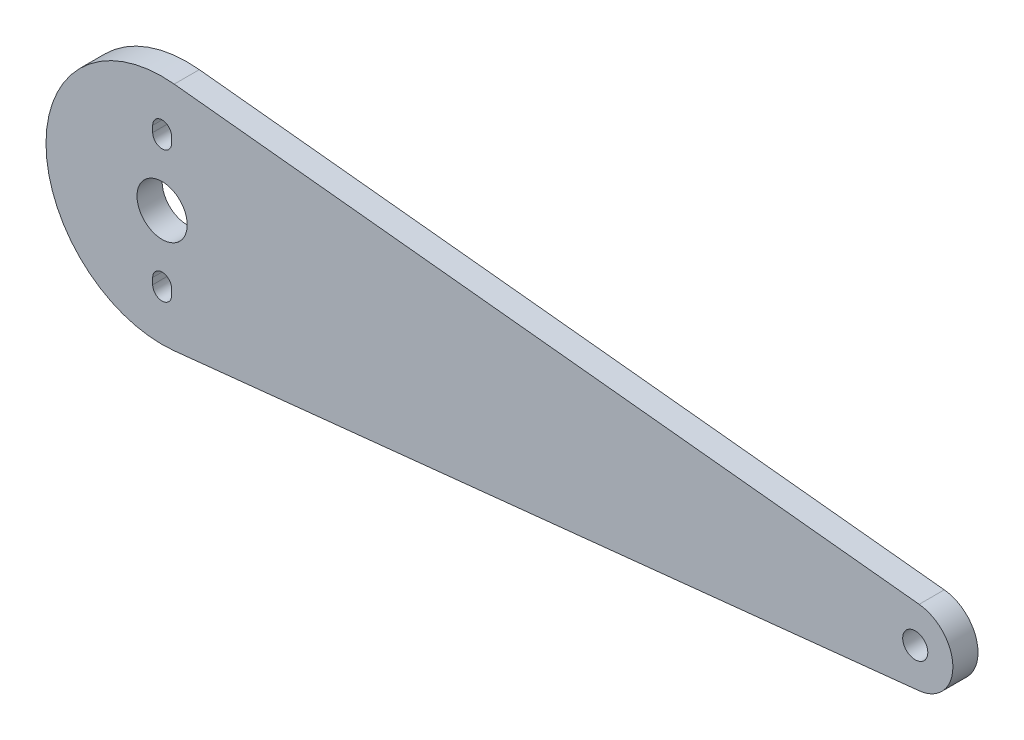
ISO-10303-21;
HEADER;
FILE_DESCRIPTION(('STEP AP214'),'2;1');
FILE_NAME('part.step','',(''),(''),'','','');
FILE_SCHEMA(('AUTOMOTIVE_DESIGN { 1 0 10303 214 1 1 1 1 }'));
ENDSEC;
DATA;
#1=APPLICATION_CONTEXT('core data for automotive mechanical design processes');
#2=APPLICATION_PROTOCOL_DEFINITION('international standard','automotive_design',2000,#1);
#3=PRODUCT_CONTEXT('',#1,'mechanical');
#4=PRODUCT('Part','Part','',(#3));
#5=PRODUCT_RELATED_PRODUCT_CATEGORY('part','',(#4));
#6=PRODUCT_DEFINITION_FORMATION('','',#4);
#7=PRODUCT_DEFINITION_CONTEXT('part definition',#1,'design');
#8=PRODUCT_DEFINITION('design','',#6,#7);
#9=PRODUCT_DEFINITION_SHAPE('','',#8);
#10=(LENGTH_UNIT() NAMED_UNIT(*) SI_UNIT(.MILLI.,.METRE.));
#11=(NAMED_UNIT(*) PLANE_ANGLE_UNIT() SI_UNIT($,.RADIAN.));
#12=(NAMED_UNIT(*) SI_UNIT($,.STERADIAN.) SOLID_ANGLE_UNIT());
#13=UNCERTAINTY_MEASURE_WITH_UNIT(LENGTH_MEASURE(1.E-05),#10,'distance_accuracy_value','');
#14=(GEOMETRIC_REPRESENTATION_CONTEXT(3) GLOBAL_UNCERTAINTY_ASSIGNED_CONTEXT((#13)) GLOBAL_UNIT_ASSIGNED_CONTEXT((#10,
#11,#12)) REPRESENTATION_CONTEXT('',''));
#15=CARTESIAN_POINT('',(0.,0.,0.));
#16=DIRECTION('',(0.,0.,1.));
#17=DIRECTION('',(1.,0.,0.));
#18=AXIS2_PLACEMENT_3D('',#15,#16,#17);
#19=CARTESIAN_POINT('',(-60.,0.,4.));
#20=DIRECTION('',(0.,0.,1.));
#21=DIRECTION('',(1.,0.,0.));
#22=AXIS2_PLACEMENT_3D('',#19,#20,#21);
#23=PLANE('',#22);
#24=DIRECTION('',(0.,-1.,0.));
#25=VECTOR('',#24,1.);
#26=CARTESIAN_POINT('',(-61.5,11.,4.));
#27=LINE('',#26,#25);
#28=CARTESIAN_POINT('',(-61.5,11.,4.));
#29=VERTEX_POINT('',#28);
#30=CARTESIAN_POINT('',(-61.5,10.,4.));
#31=VERTEX_POINT('',#30);
#32=EDGE_CURVE('E159',#29,#31,#27,.T.);
#33=ORIENTED_EDGE('',*,*,#32,.F.);
#34=CARTESIAN_POINT('',(-60.,11.,4.));
#35=DIRECTION('',(0.,0.,1.));
#36=DIRECTION('',(1.,0.,0.));
#37=AXIS2_PLACEMENT_3D('',#34,#35,#36);
#38=CIRCLE('',#37,1.50000000000002);
#39=CARTESIAN_POINT('',(-58.5,11.,4.));
#40=VERTEX_POINT('',#39);
#41=EDGE_CURVE('E157',#40,#29,#38,.T.);
#42=ORIENTED_EDGE('',*,*,#41,.F.);
#43=DIRECTION('',(0.,1.,0.));
#44=VECTOR('',#43,1.);
#45=CARTESIAN_POINT('',(-58.5,11.,4.));
#46=LINE('',#45,#44);
#47=CARTESIAN_POINT('',(-58.5,10.,4.));
#48=VERTEX_POINT('',#47);
#49=EDGE_CURVE('E165',#48,#40,#46,.T.);
#50=ORIENTED_EDGE('',*,*,#49,.F.);
#51=CARTESIAN_POINT('',(-60.,10.,4.));
#52=DIRECTION('',(0.,0.,1.));
#53=DIRECTION('',(1.,0.,0.));
#54=AXIS2_PLACEMENT_3D('',#51,#52,#53);
#55=CIRCLE('',#54,1.50000000000002);
#56=EDGE_CURVE('E162',#31,#48,#55,.T.);
#57=ORIENTED_EDGE('',*,*,#56,.F.);
#58=EDGE_LOOP('',(#33,#42,#50,#57));
#59=FACE_BOUND('',#58,.T.);
#60=CARTESIAN_POINT('',(60.,0.,4.));
#61=DIRECTION('',(0.,0.,1.));
#62=DIRECTION('',(1.,0.,0.));
#63=AXIS2_PLACEMENT_3D('',#60,#61,#62);
#64=CIRCLE('',#63,2.);
#65=CARTESIAN_POINT('',(62.,0.,4.));
#66=VERTEX_POINT('',#65);
#67=EDGE_CURVE('E194',#66,#66,#64,.T.);
#68=ORIENTED_EDGE('',*,*,#67,.F.);
#69=EDGE_LOOP('',(#68));
#70=FACE_BOUND('',#69,.T.);
#71=CARTESIAN_POINT('',(-60.,0.,4.));
#72=DIRECTION('',(0.,0.,1.));
#73=DIRECTION('',(1.,0.,0.));
#74=AXIS2_PLACEMENT_3D('',#71,#72,#73);
#75=CIRCLE('',#74,18.5);
#76=CARTESIAN_POINT('',(-58.0729166666667,18.399357321015,4.));
#77=VERTEX_POINT('',#76);
#78=CARTESIAN_POINT('',(-58.0729166666667,-18.399357321015,4.));
#79=VERTEX_POINT('',#78);
#80=EDGE_CURVE('E200',#77,#79,#75,.T.);
#81=ORIENTED_EDGE('',*,*,#80,.T.);
#82=DIRECTION('',(0.994559855190001,0.104166666666667,0.));
#83=VECTOR('',#82,1.);
#84=CARTESIAN_POINT('',(-58.0729166666667,-18.399357321015,4.));
#85=LINE('',#84,#83);
#86=CARTESIAN_POINT('',(60.625,-5.96735913114,4.));
#87=VERTEX_POINT('',#86);
#88=EDGE_CURVE('E203',#79,#87,#85,.T.);
#89=ORIENTED_EDGE('',*,*,#88,.T.);
#90=CARTESIAN_POINT('',(60.,0.,4.));
#91=DIRECTION('',(0.,0.,1.));
#92=DIRECTION('',(1.,0.,0.));
#93=AXIS2_PLACEMENT_3D('',#90,#91,#92);
#94=CIRCLE('',#93,6.);
#95=CARTESIAN_POINT('',(60.625,5.96735913114001,4.));
#96=VERTEX_POINT('',#95);
#97=EDGE_CURVE('E206',#87,#96,#94,.T.);
#98=ORIENTED_EDGE('',*,*,#97,.T.);
#99=DIRECTION('',(-0.994559855190001,0.104166666666667,0.));
#100=VECTOR('',#99,1.);
#101=CARTESIAN_POINT('',(-58.0729166666667,18.399357321015,4.));
#102=LINE('',#101,#100);
#103=EDGE_CURVE('E208',#96,#77,#102,.T.);
#104=ORIENTED_EDGE('',*,*,#103,.T.);
#105=EDGE_LOOP('',(#81,#89,#98,#104));
#106=FACE_BOUND('',#105,.T.);
#107=CARTESIAN_POINT('',(-60.,0.,4.));
#108=DIRECTION('',(0.,0.,1.));
#109=DIRECTION('',(1.,0.,0.));
#110=AXIS2_PLACEMENT_3D('',#107,#108,#109);
#111=CIRCLE('',#110,4.00000000000001);
#112=CARTESIAN_POINT('',(-56.,0.,4.));
#113=VERTEX_POINT('',#112);
#114=EDGE_CURVE('E188',#113,#113,#111,.T.);
#115=ORIENTED_EDGE('',*,*,#114,.F.);
#116=EDGE_LOOP('',(#115));
#117=FACE_BOUND('',#116,.T.);
#118=DIRECTION('',(0.,1.,0.));
#119=VECTOR('',#118,1.);
#120=CARTESIAN_POINT('',(-58.5,-11.,4.));
#121=LINE('',#120,#119);
#122=CARTESIAN_POINT('',(-58.5,-11.,4.));
#123=VERTEX_POINT('',#122);
#124=CARTESIAN_POINT('',(-58.5,-10.,4.));
#125=VERTEX_POINT('',#124);
#126=EDGE_CURVE('E129',#123,#125,#121,.T.);
#127=ORIENTED_EDGE('',*,*,#126,.F.);
#128=CARTESIAN_POINT('',(-60.,-11.,4.));
#129=DIRECTION('',(0.,0.,1.));
#130=DIRECTION('',(-1.,0.,0.));
#131=AXIS2_PLACEMENT_3D('',#128,#129,#130);
#132=CIRCLE('',#131,1.50000000000002);
#133=CARTESIAN_POINT('',(-61.5,-11.,4.));
#134=VERTEX_POINT('',#133);
#135=EDGE_CURVE('E121',#134,#123,#132,.T.);
#136=ORIENTED_EDGE('',*,*,#135,.F.);
#137=DIRECTION('',(0.,-1.,0.));
#138=VECTOR('',#137,1.);
#139=CARTESIAN_POINT('',(-61.5,-11.,4.));
#140=LINE('',#139,#138);
#141=CARTESIAN_POINT('',(-61.5,-10.,4.));
#142=VERTEX_POINT('',#141);
#143=EDGE_CURVE('E143',#142,#134,#140,.T.);
#144=ORIENTED_EDGE('',*,*,#143,.F.);
#145=CARTESIAN_POINT('',(-60.,-10.,4.));
#146=DIRECTION('',(0.,0.,1.));
#147=DIRECTION('',(-1.,0.,0.));
#148=AXIS2_PLACEMENT_3D('',#145,#146,#147);
#149=CIRCLE('',#148,1.50000000000002);
#150=EDGE_CURVE('E141',#125,#142,#149,.T.);
#151=ORIENTED_EDGE('',*,*,#150,.F.);
#152=EDGE_LOOP('',(#127,#136,#144,#151));
#153=FACE_BOUND('',#152,.T.);
#154=ADVANCED_FACE('F32',(#59,#70,#106,#117,#153),#23,.T.);
#155=CARTESIAN_POINT('',(-60.,0.,0.));
#156=DIRECTION('',(0.,0.,1.));
#157=DIRECTION('',(1.,0.,0.));
#158=AXIS2_PLACEMENT_3D('',#155,#156,#157);
#159=PLANE('',#158);
#160=CARTESIAN_POINT('',(-60.,11.,0.));
#161=DIRECTION('',(0.,0.,1.));
#162=DIRECTION('',(1.,0.,0.));
#163=AXIS2_PLACEMENT_3D('',#160,#161,#162);
#164=CIRCLE('',#163,1.50000000000002);
#165=CARTESIAN_POINT('',(-58.5,11.,0.));
#166=VERTEX_POINT('',#165);
#167=CARTESIAN_POINT('',(-61.5,11.,0.));
#168=VERTEX_POINT('',#167);
#169=EDGE_CURVE('E137',#166,#168,#164,.T.);
#170=ORIENTED_EDGE('',*,*,#169,.T.);
#171=DIRECTION('',(0.,-1.,0.));
#172=VECTOR('',#171,1.);
#173=CARTESIAN_POINT('',(-61.5,11.,0.));
#174=LINE('',#173,#172);
#175=CARTESIAN_POINT('',(-61.5,10.,0.));
#176=VERTEX_POINT('',#175);
#177=EDGE_CURVE('E170',#168,#176,#174,.T.);
#178=ORIENTED_EDGE('',*,*,#177,.T.);
#179=CARTESIAN_POINT('',(-60.,10.,0.));
#180=DIRECTION('',(0.,0.,1.));
#181=DIRECTION('',(1.,0.,0.));
#182=AXIS2_PLACEMENT_3D('',#179,#180,#181);
#183=CIRCLE('',#182,1.50000000000002);
#184=CARTESIAN_POINT('',(-58.5,10.,0.));
#185=VERTEX_POINT('',#184);
#186=EDGE_CURVE('E173',#176,#185,#183,.T.);
#187=ORIENTED_EDGE('',*,*,#186,.T.);
#188=DIRECTION('',(0.,1.,0.));
#189=VECTOR('',#188,1.);
#190=CARTESIAN_POINT('',(-58.5,11.,0.));
#191=LINE('',#190,#189);
#192=EDGE_CURVE('E160',#185,#166,#191,.T.);
#193=ORIENTED_EDGE('',*,*,#192,.T.);
#194=EDGE_LOOP('',(#170,#178,#187,#193));
#195=FACE_BOUND('',#194,.T.);
#196=CARTESIAN_POINT('',(60.,0.,0.));
#197=DIRECTION('',(0.,0.,1.));
#198=DIRECTION('',(1.,0.,0.));
#199=AXIS2_PLACEMENT_3D('',#196,#197,#198);
#200=CIRCLE('',#199,2.);
#201=CARTESIAN_POINT('',(62.,0.,0.));
#202=VERTEX_POINT('',#201);
#203=EDGE_CURVE('E191',#202,#202,#200,.T.);
#204=ORIENTED_EDGE('',*,*,#203,.T.);
#205=EDGE_LOOP('',(#204));
#206=FACE_BOUND('',#205,.T.);
#207=CARTESIAN_POINT('',(-60.,0.,0.));
#208=DIRECTION('',(0.,0.,1.));
#209=DIRECTION('',(1.,0.,0.));
#210=AXIS2_PLACEMENT_3D('',#207,#208,#209);
#211=CIRCLE('',#210,18.5);
#212=CARTESIAN_POINT('',(-58.0729166666667,18.399357321015,0.));
#213=VERTEX_POINT('',#212);
#214=CARTESIAN_POINT('',(-58.0729166666667,-18.399357321015,0.));
#215=VERTEX_POINT('',#214);
#216=EDGE_CURVE('E197',#213,#215,#211,.T.);
#217=ORIENTED_EDGE('',*,*,#216,.F.);
#218=DIRECTION('',(-0.994559855190001,0.104166666666667,0.));
#219=VECTOR('',#218,1.);
#220=CARTESIAN_POINT('',(-58.0729166666667,18.399357321015,0.));
#221=LINE('',#220,#219);
#222=CARTESIAN_POINT('',(60.625,5.96735913114001,0.));
#223=VERTEX_POINT('',#222);
#224=EDGE_CURVE('E204',#223,#213,#221,.T.);
#225=ORIENTED_EDGE('',*,*,#224,.F.);
#226=CARTESIAN_POINT('',(60.,0.,0.));
#227=DIRECTION('',(0.,0.,1.));
#228=DIRECTION('',(1.,0.,0.));
#229=AXIS2_PLACEMENT_3D('',#226,#227,#228);
#230=CIRCLE('',#229,6.);
#231=CARTESIAN_POINT('',(60.625,-5.96735913114,0.));
#232=VERTEX_POINT('',#231);
#233=EDGE_CURVE('E215',#232,#223,#230,.T.);
#234=ORIENTED_EDGE('',*,*,#233,.F.);
#235=DIRECTION('',(0.994559855190001,0.104166666666667,0.));
#236=VECTOR('',#235,1.);
#237=CARTESIAN_POINT('',(-58.0729166666667,-18.399357321015,0.));
#238=LINE('',#237,#236);
#239=EDGE_CURVE('E213',#215,#232,#238,.T.);
#240=ORIENTED_EDGE('',*,*,#239,.F.);
#241=EDGE_LOOP('',(#217,#225,#234,#240));
#242=FACE_BOUND('',#241,.T.);
#243=CARTESIAN_POINT('',(-60.,0.,0.));
#244=DIRECTION('',(0.,0.,1.));
#245=DIRECTION('',(1.,0.,0.));
#246=AXIS2_PLACEMENT_3D('',#243,#244,#245);
#247=CIRCLE('',#246,4.00000000000001);
#248=CARTESIAN_POINT('',(-56.,0.,0.));
#249=VERTEX_POINT('',#248);
#250=EDGE_CURVE('E187',#249,#249,#247,.T.);
#251=ORIENTED_EDGE('',*,*,#250,.T.);
#252=EDGE_LOOP('',(#251));
#253=FACE_BOUND('',#252,.T.);
#254=CARTESIAN_POINT('',(-60.,-11.,0.));
#255=DIRECTION('',(0.,0.,1.));
#256=DIRECTION('',(-1.,0.,0.));
#257=AXIS2_PLACEMENT_3D('',#254,#255,#256);
#258=CIRCLE('',#257,1.50000000000002);
#259=CARTESIAN_POINT('',(-61.5,-11.,0.));
#260=VERTEX_POINT('',#259);
#261=CARTESIAN_POINT('',(-58.5,-11.,0.));
#262=VERTEX_POINT('',#261);
#263=EDGE_CURVE('E55',#260,#262,#258,.T.);
#264=ORIENTED_EDGE('',*,*,#263,.T.);
#265=DIRECTION('',(0.,1.,0.));
#266=VECTOR('',#265,1.);
#267=CARTESIAN_POINT('',(-58.5,-11.,0.));
#268=LINE('',#267,#266);
#269=CARTESIAN_POINT('',(-58.5,-10.,0.));
#270=VERTEX_POINT('',#269);
#271=EDGE_CURVE('E136',#262,#270,#268,.T.);
#272=ORIENTED_EDGE('',*,*,#271,.T.);
#273=CARTESIAN_POINT('',(-60.,-10.,0.));
#274=DIRECTION('',(0.,0.,1.));
#275=DIRECTION('',(-1.,0.,0.));
#276=AXIS2_PLACEMENT_3D('',#273,#274,#275);
#277=CIRCLE('',#276,1.50000000000002);
#278=CARTESIAN_POINT('',(-61.5,-10.,0.));
#279=VERTEX_POINT('',#278);
#280=EDGE_CURVE('E149',#270,#279,#277,.T.);
#281=ORIENTED_EDGE('',*,*,#280,.T.);
#282=DIRECTION('',(0.,-1.,0.));
#283=VECTOR('',#282,1.);
#284=CARTESIAN_POINT('',(-61.5,-11.,0.));
#285=LINE('',#284,#283);
#286=EDGE_CURVE('E130',#279,#260,#285,.T.);
#287=ORIENTED_EDGE('',*,*,#286,.T.);
#288=EDGE_LOOP('',(#264,#272,#281,#287));
#289=FACE_BOUND('',#288,.T.);
#290=ADVANCED_FACE('F233',(#195,#206,#242,#253,#289),#159,.F.);
#291=CARTESIAN_POINT('',(-60.,0.,4.));
#292=DIRECTION('',(0.,0.,-1.));
#293=DIRECTION('',(-1.,0.,0.));
#294=AXIS2_PLACEMENT_3D('',#291,#292,#293);
#295=CYLINDRICAL_SURFACE('',#294,18.5);
#296=ORIENTED_EDGE('',*,*,#216,.T.);
#297=DIRECTION('',(0.,0.,-1.));
#298=VECTOR('',#297,1.);
#299=CARTESIAN_POINT('',(-58.0729166666667,-18.399357321015,4.));
#300=LINE('',#299,#298);
#301=EDGE_CURVE('E11',#79,#215,#300,.T.);
#302=ORIENTED_EDGE('',*,*,#301,.F.);
#303=ORIENTED_EDGE('',*,*,#80,.F.);
#304=DIRECTION('',(0.,0.,-1.));
#305=VECTOR('',#304,1.);
#306=CARTESIAN_POINT('',(-58.0729166666667,18.399357321015,4.));
#307=LINE('',#306,#305);
#308=EDGE_CURVE('E210',#77,#213,#307,.T.);
#309=ORIENTED_EDGE('',*,*,#308,.T.);
#310=EDGE_LOOP('',(#296,#302,#303,#309));
#311=FACE_BOUND('',#310,.T.);
#312=ADVANCED_FACE('F34',(#311),#295,.T.);
#313=CARTESIAN_POINT('',(-58.0729166666667,-18.399357321015,4.));
#314=DIRECTION('',(-0.104166666666667,0.994559855190001,0.));
#315=DIRECTION('',(-0.994559855190001,-0.104166666666667,0.));
#316=AXIS2_PLACEMENT_3D('',#313,#314,#315);
#317=PLANE('',#316);
#318=ORIENTED_EDGE('',*,*,#239,.T.);
#319=DIRECTION('',(0.,0.,-1.));
#320=VECTOR('',#319,1.);
#321=CARTESIAN_POINT('',(60.625,-5.96735913114,4.));
#322=LINE('',#321,#320);
#323=EDGE_CURVE('E40',#87,#232,#322,.T.);
#324=ORIENTED_EDGE('',*,*,#323,.F.);
#325=ORIENTED_EDGE('',*,*,#88,.F.);
#326=ORIENTED_EDGE('',*,*,#301,.T.);
#327=EDGE_LOOP('',(#318,#324,#325,#326));
#328=FACE_BOUND('',#327,.T.);
#329=ADVANCED_FACE('F244',(#328),#317,.F.);
#330=CARTESIAN_POINT('',(60.,0.,4.));
#331=DIRECTION('',(0.,0.,-1.));
#332=DIRECTION('',(-1.,0.,0.));
#333=AXIS2_PLACEMENT_3D('',#330,#331,#332);
#334=CYLINDRICAL_SURFACE('',#333,6.);
#335=ORIENTED_EDGE('',*,*,#233,.T.);
#336=DIRECTION('',(0.,0.,-1.));
#337=VECTOR('',#336,1.);
#338=CARTESIAN_POINT('',(60.625,5.96735913114001,4.));
#339=LINE('',#338,#337);
#340=EDGE_CURVE('E220',#96,#223,#339,.T.);
#341=ORIENTED_EDGE('',*,*,#340,.F.);
#342=ORIENTED_EDGE('',*,*,#97,.F.);
#343=ORIENTED_EDGE('',*,*,#323,.T.);
#344=EDGE_LOOP('',(#335,#341,#342,#343));
#345=FACE_BOUND('',#344,.T.);
#346=ADVANCED_FACE('F227',(#345),#334,.T.);
#347=CARTESIAN_POINT('',(-58.0729166666667,18.399357321015,4.));
#348=DIRECTION('',(-0.104166666666667,-0.994559855190001,0.));
#349=DIRECTION('',(0.994559855190001,-0.104166666666667,0.));
#350=AXIS2_PLACEMENT_3D('',#347,#348,#349);
#351=PLANE('',#350);
#352=ORIENTED_EDGE('',*,*,#224,.T.);
#353=ORIENTED_EDGE('',*,*,#308,.F.);
#354=ORIENTED_EDGE('',*,*,#103,.F.);
#355=ORIENTED_EDGE('',*,*,#340,.T.);
#356=EDGE_LOOP('',(#352,#353,#354,#355));
#357=FACE_BOUND('',#356,.T.);
#358=ADVANCED_FACE('F237',(#357),#351,.F.);
#359=CARTESIAN_POINT('',(60.,0.,4.));
#360=DIRECTION('',(0.,0.,-1.));
#361=DIRECTION('',(-1.,0.,0.));
#362=AXIS2_PLACEMENT_3D('',#359,#360,#361);
#363=CYLINDRICAL_SURFACE('',#362,2.);
#364=ORIENTED_EDGE('',*,*,#67,.T.);
#365=EDGE_LOOP('',(#364));
#366=FACE_BOUND('',#365,.T.);
#367=ORIENTED_EDGE('',*,*,#203,.F.);
#368=EDGE_LOOP('',(#367));
#369=FACE_BOUND('',#368,.T.);
#370=ADVANCED_FACE('F262',(#366,#369),#363,.F.);
#371=CARTESIAN_POINT('',(-60.,0.,4.));
#372=DIRECTION('',(0.,0.,-1.));
#373=DIRECTION('',(-1.,0.,0.));
#374=AXIS2_PLACEMENT_3D('',#371,#372,#373);
#375=CYLINDRICAL_SURFACE('',#374,4.00000000000001);
#376=ORIENTED_EDGE('',*,*,#114,.T.);
#377=EDGE_LOOP('',(#376));
#378=FACE_BOUND('',#377,.T.);
#379=ORIENTED_EDGE('',*,*,#250,.F.);
#380=EDGE_LOOP('',(#379));
#381=FACE_BOUND('',#380,.T.);
#382=ADVANCED_FACE('F269',(#378,#381),#375,.F.);
#383=CARTESIAN_POINT('',(-60.,11.,4.));
#384=DIRECTION('',(0.,0.,-1.));
#385=DIRECTION('',(-1.,0.,0.));
#386=AXIS2_PLACEMENT_3D('',#383,#384,#385);
#387=CYLINDRICAL_SURFACE('',#386,1.50000000000002);
#388=ORIENTED_EDGE('',*,*,#169,.F.);
#389=DIRECTION('',(0.,0.,-1.));
#390=VECTOR('',#389,1.);
#391=CARTESIAN_POINT('',(-58.5,11.,4.));
#392=LINE('',#391,#390);
#393=EDGE_CURVE('E167',#40,#166,#392,.T.);
#394=ORIENTED_EDGE('',*,*,#393,.F.);
#395=ORIENTED_EDGE('',*,*,#41,.T.);
#396=DIRECTION('',(0.,0.,-1.));
#397=VECTOR('',#396,1.);
#398=CARTESIAN_POINT('',(-61.5,11.,4.));
#399=LINE('',#398,#397);
#400=EDGE_CURVE('E184',#29,#168,#399,.T.);
#401=ORIENTED_EDGE('',*,*,#400,.T.);
#402=EDGE_LOOP('',(#388,#394,#395,#401));
#403=FACE_BOUND('',#402,.T.);
#404=ADVANCED_FACE('F274',(#403),#387,.F.);
#405=CARTESIAN_POINT('',(-61.5,11.,4.));
#406=DIRECTION('',(1.,0.,0.));
#407=DIRECTION('',(0.,0.,-1.));
#408=AXIS2_PLACEMENT_3D('',#405,#406,#407);
#409=PLANE('',#408);
#410=ORIENTED_EDGE('',*,*,#177,.F.);
#411=ORIENTED_EDGE('',*,*,#400,.F.);
#412=ORIENTED_EDGE('',*,*,#32,.T.);
#413=DIRECTION('',(0.,0.,-1.));
#414=VECTOR('',#413,1.);
#415=CARTESIAN_POINT('',(-61.5,10.,4.));
#416=LINE('',#415,#414);
#417=EDGE_CURVE('E182',#31,#176,#416,.T.);
#418=ORIENTED_EDGE('',*,*,#417,.T.);
#419=EDGE_LOOP('',(#410,#411,#412,#418));
#420=FACE_BOUND('',#419,.T.);
#421=ADVANCED_FACE('F283',(#420),#409,.T.);
#422=CARTESIAN_POINT('',(-60.,10.,4.));
#423=DIRECTION('',(0.,0.,-1.));
#424=DIRECTION('',(-1.,0.,0.));
#425=AXIS2_PLACEMENT_3D('',#422,#423,#424);
#426=CYLINDRICAL_SURFACE('',#425,1.50000000000002);
#427=ORIENTED_EDGE('',*,*,#186,.F.);
#428=ORIENTED_EDGE('',*,*,#417,.F.);
#429=ORIENTED_EDGE('',*,*,#56,.T.);
#430=DIRECTION('',(0.,0.,-1.));
#431=VECTOR('',#430,1.);
#432=CARTESIAN_POINT('',(-58.5,10.,4.));
#433=LINE('',#432,#431);
#434=EDGE_CURVE('E180',#48,#185,#433,.T.);
#435=ORIENTED_EDGE('',*,*,#434,.T.);
#436=EDGE_LOOP('',(#427,#428,#429,#435));
#437=FACE_BOUND('',#436,.T.);
#438=ADVANCED_FACE('F290',(#437),#426,.F.);
#439=CARTESIAN_POINT('',(-58.5,11.,4.));
#440=DIRECTION('',(-1.,0.,0.));
#441=DIRECTION('',(0.,0.,1.));
#442=AXIS2_PLACEMENT_3D('',#439,#440,#441);
#443=PLANE('',#442);
#444=ORIENTED_EDGE('',*,*,#192,.F.);
#445=ORIENTED_EDGE('',*,*,#434,.F.);
#446=ORIENTED_EDGE('',*,*,#49,.T.);
#447=ORIENTED_EDGE('',*,*,#393,.T.);
#448=EDGE_LOOP('',(#444,#445,#446,#447));
#449=FACE_BOUND('',#448,.T.);
#450=ADVANCED_FACE('F294',(#449),#443,.T.);
#451=CARTESIAN_POINT('',(-60.,-11.,4.));
#452=DIRECTION('',(0.,0.,-1.));
#453=DIRECTION('',(-1.,0.,0.));
#454=AXIS2_PLACEMENT_3D('',#451,#452,#453);
#455=CYLINDRICAL_SURFACE('',#454,1.50000000000002);
#456=ORIENTED_EDGE('',*,*,#263,.F.);
#457=DIRECTION('',(0.,0.,-1.));
#458=VECTOR('',#457,1.);
#459=CARTESIAN_POINT('',(-61.5,-11.,4.));
#460=LINE('',#459,#458);
#461=EDGE_CURVE('E125',#134,#260,#460,.T.);
#462=ORIENTED_EDGE('',*,*,#461,.F.);
#463=ORIENTED_EDGE('',*,*,#135,.T.);
#464=DIRECTION('',(0.,0.,-1.));
#465=VECTOR('',#464,1.);
#466=CARTESIAN_POINT('',(-58.5,-11.,4.));
#467=LINE('',#466,#465);
#468=EDGE_CURVE('E124',#123,#262,#467,.T.);
#469=ORIENTED_EDGE('',*,*,#468,.T.);
#470=EDGE_LOOP('',(#456,#462,#463,#469));
#471=FACE_BOUND('',#470,.T.);
#472=ADVANCED_FACE('F123',(#471),#455,.F.);
#473=CARTESIAN_POINT('',(-58.5,-11.,4.));
#474=DIRECTION('',(-1.,0.,0.));
#475=DIRECTION('',(0.,0.,1.));
#476=AXIS2_PLACEMENT_3D('',#473,#474,#475);
#477=PLANE('',#476);
#478=ORIENTED_EDGE('',*,*,#271,.F.);
#479=ORIENTED_EDGE('',*,*,#468,.F.);
#480=ORIENTED_EDGE('',*,*,#126,.T.);
#481=DIRECTION('',(0.,0.,-1.));
#482=VECTOR('',#481,1.);
#483=CARTESIAN_POINT('',(-58.5,-10.,4.));
#484=LINE('',#483,#482);
#485=EDGE_CURVE('E138',#125,#270,#484,.T.);
#486=ORIENTED_EDGE('',*,*,#485,.T.);
#487=EDGE_LOOP('',(#478,#479,#480,#486));
#488=FACE_BOUND('',#487,.T.);
#489=ADVANCED_FACE('F133',(#488),#477,.T.);
#490=CARTESIAN_POINT('',(-60.,-10.,4.));
#491=DIRECTION('',(0.,0.,-1.));
#492=DIRECTION('',(-1.,0.,0.));
#493=AXIS2_PLACEMENT_3D('',#490,#491,#492);
#494=CYLINDRICAL_SURFACE('',#493,1.50000000000002);
#495=ORIENTED_EDGE('',*,*,#280,.F.);
#496=ORIENTED_EDGE('',*,*,#485,.F.);
#497=ORIENTED_EDGE('',*,*,#150,.T.);
#498=DIRECTION('',(0.,0.,-1.));
#499=VECTOR('',#498,1.);
#500=CARTESIAN_POINT('',(-61.5,-10.,4.));
#501=LINE('',#500,#499);
#502=EDGE_CURVE('E47',#142,#279,#501,.T.);
#503=ORIENTED_EDGE('',*,*,#502,.T.);
#504=EDGE_LOOP('',(#495,#496,#497,#503));
#505=FACE_BOUND('',#504,.T.);
#506=ADVANCED_FACE('F303',(#505),#494,.F.);
#507=CARTESIAN_POINT('',(-61.5,-11.,4.));
#508=DIRECTION('',(1.,0.,0.));
#509=DIRECTION('',(0.,0.,-1.));
#510=AXIS2_PLACEMENT_3D('',#507,#508,#509);
#511=PLANE('',#510);
#512=ORIENTED_EDGE('',*,*,#286,.F.);
#513=ORIENTED_EDGE('',*,*,#502,.F.);
#514=ORIENTED_EDGE('',*,*,#143,.T.);
#515=ORIENTED_EDGE('',*,*,#461,.T.);
#516=EDGE_LOOP('',(#512,#513,#514,#515));
#517=FACE_BOUND('',#516,.T.);
#518=ADVANCED_FACE('F306',(#517),#511,.T.);
#519=CLOSED_SHELL('',(#154,#290,#312,#329,#346,#358,#370,#382,#404,#421,#438,#450,#472,#489,
#506,#518));
#520=MANIFOLD_SOLID_BREP('B2',#519);
#521=ADVANCED_BREP_SHAPE_REPRESENTATION('',(#18,#520),#14);
#522=SHAPE_DEFINITION_REPRESENTATION(#9,#521);
ENDSEC;
END-ISO-10303-21;
